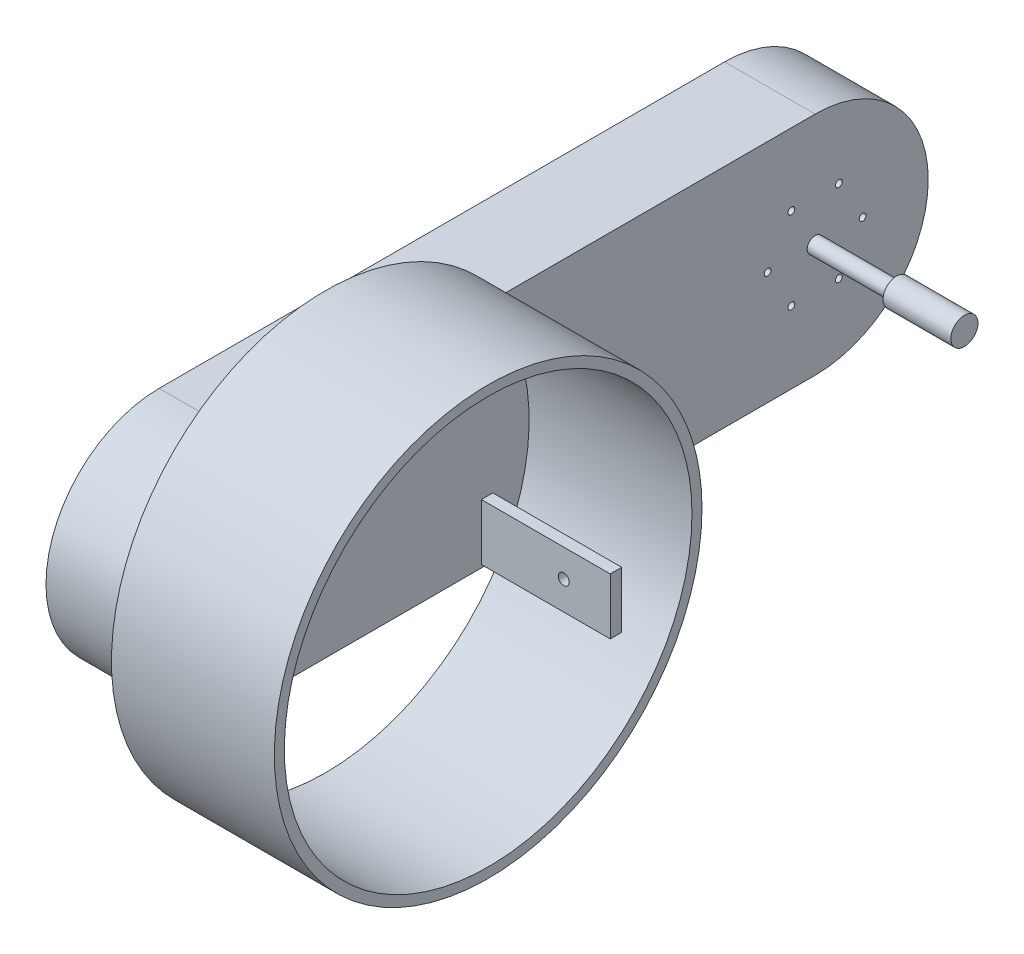
ISO-10303-21;
HEADER;
FILE_DESCRIPTION(('STEP AP214'),'2;1');
FILE_NAME('part.step','',(''),(''),'','','');
FILE_SCHEMA(('AUTOMOTIVE_DESIGN { 1 0 10303 214 1 1 1 1 }'));
ENDSEC;
DATA;
#1=APPLICATION_CONTEXT('core data for automotive mechanical design processes');
#2=APPLICATION_PROTOCOL_DEFINITION('international standard','automotive_design',2000,#1);
#3=PRODUCT_CONTEXT('',#1,'mechanical');
#4=PRODUCT('Part','Part','',(#3));
#5=PRODUCT_RELATED_PRODUCT_CATEGORY('part','',(#4));
#6=PRODUCT_DEFINITION_FORMATION('','',#4);
#7=PRODUCT_DEFINITION_CONTEXT('part definition',#1,'design');
#8=PRODUCT_DEFINITION('design','',#6,#7);
#9=PRODUCT_DEFINITION_SHAPE('','',#8);
#10=(LENGTH_UNIT() NAMED_UNIT(*) SI_UNIT(.MILLI.,.METRE.));
#11=(NAMED_UNIT(*) PLANE_ANGLE_UNIT() SI_UNIT($,.RADIAN.));
#12=(NAMED_UNIT(*) SI_UNIT($,.STERADIAN.) SOLID_ANGLE_UNIT());
#13=UNCERTAINTY_MEASURE_WITH_UNIT(LENGTH_MEASURE(1.E-05),#10,'distance_accuracy_value','');
#14=(GEOMETRIC_REPRESENTATION_CONTEXT(3) GLOBAL_UNCERTAINTY_ASSIGNED_CONTEXT((#13)) GLOBAL_UNIT_ASSIGNED_CONTEXT((#10,
#11,#12)) REPRESENTATION_CONTEXT('',''));
#15=CARTESIAN_POINT('',(0.,0.,0.));
#16=DIRECTION('',(0.,0.,1.));
#17=DIRECTION('',(1.,0.,0.));
#18=AXIS2_PLACEMENT_3D('',#15,#16,#17);
#19=CARTESIAN_POINT('',(40.,0.,0.));
#20=DIRECTION('',(1.,0.,0.));
#21=DIRECTION('',(0.,0.,-1.));
#22=AXIS2_PLACEMENT_3D('',#19,#20,#21);
#23=PLANE('',#22);
#24=DIRECTION('',(0.,0.,-1.));
#25=VECTOR('',#24,1.);
#26=CARTESIAN_POINT('',(40.,-44.7998879399822,-94.7304857898006));
#27=LINE('',#26,#25);
#28=CARTESIAN_POINT('',(40.,-44.7998879399822,-94.7304857898006));
#29=VERTEX_POINT('',#28);
#30=CARTESIAN_POINT('',(40.,-44.7998879399822,-99.8044234524712));
#31=VERTEX_POINT('',#30);
#32=EDGE_CURVE('E198',#29,#31,#27,.T.);
#33=ORIENTED_EDGE('',*,*,#32,.F.);
#34=DIRECTION('',(0.,-1.,0.));
#35=VECTOR('',#34,1.);
#36=CARTESIAN_POINT('',(40.,-19.9063820917189,-94.7304857898006));
#37=LINE('',#36,#35);
#38=CARTESIAN_POINT('',(40.,-19.9063820917189,-94.7304857898006));
#39=VERTEX_POINT('',#38);
#40=EDGE_CURVE('E184',#39,#29,#37,.T.);
#41=ORIENTED_EDGE('',*,*,#40,.F.);
#42=DIRECTION('',(0.,0.,1.));
#43=VECTOR('',#42,1.);
#44=CARTESIAN_POINT('',(40.,-19.9063820917189,-94.7304857898006));
#45=LINE('',#44,#43);
#46=CARTESIAN_POINT('',(40.,-19.9063820917189,-99.8044234524712));
#47=VERTEX_POINT('',#46);
#48=EDGE_CURVE('E189',#47,#39,#45,.T.);
#49=ORIENTED_EDGE('',*,*,#48,.F.);
#50=DIRECTION('',(0.,1.,0.));
#51=VECTOR('',#50,1.);
#52=CARTESIAN_POINT('',(40.,-19.9063820917189,-99.8044234524712));
#53=LINE('',#52,#51);
#54=EDGE_CURVE('E200',#31,#47,#53,.T.);
#55=ORIENTED_EDGE('',*,*,#54,.F.);
#56=EDGE_LOOP('',(#33,#41,#49,#55));
#57=FACE_BOUND('',#56,.T.);
#58=CARTESIAN_POINT('',(40.,0.,0.));
#59=DIRECTION('',(1.,0.,0.));
#60=DIRECTION('',(0.,0.,-1.));
#61=AXIS2_PLACEMENT_3D('',#58,#59,#60);
#62=CIRCLE('',#61,7.62127311165986);
#63=CARTESIAN_POINT('',(40.,0.,-7.62127311165986));
#64=VERTEX_POINT('',#63);
#65=EDGE_CURVE('E213',#64,#64,#62,.T.);
#66=ORIENTED_EDGE('',*,*,#65,.F.);
#67=EDGE_LOOP('',(#66));
#68=FACE_BOUND('',#67,.T.);
#69=CARTESIAN_POINT('',(40.,-8.6577510137719E-12,-25.7499999999999));
#70=DIRECTION('',(1.,0.,0.));
#71=DIRECTION('',(0.,0.,-1.));
#72=AXIS2_PLACEMENT_3D('',#69,#70,#71);
#73=CIRCLE('',#72,90.1076127938101);
#74=CARTESIAN_POINT('',(40.,-46.1403508771913,-103.147996772072));
#75=VERTEX_POINT('',#74);
#76=CARTESIAN_POINT('',(40.,53.8596491228087,-97.9893250229139));
#77=VERTEX_POINT('',#76);
#78=EDGE_CURVE('E156',#75,#77,#73,.T.);
#79=ORIENTED_EDGE('',*,*,#78,.T.);
#80=DIRECTION('',(0.,0.,1.));
#81=VECTOR('',#80,1.);
#82=CARTESIAN_POINT('',(40.,53.8596491228087,0.));
#83=LINE('',#82,#81);
#84=CARTESIAN_POINT('',(40.,53.8596491228087,7.70897832817341));
#85=VERTEX_POINT('',#84);
#86=EDGE_CURVE('E142',#77,#85,#83,.T.);
#87=ORIENTED_EDGE('',*,*,#86,.T.);
#88=CARTESIAN_POINT('',(40.,3.85964912280871,7.70897832817341));
#89=DIRECTION('',(1.,0.,0.));
#90=DIRECTION('',(0.,0.,-1.));
#91=AXIS2_PLACEMENT_3D('',#88,#89,#90);
#92=CIRCLE('',#91,50.);
#93=CARTESIAN_POINT('',(40.,-46.1403508771913,7.70897832817338));
#94=VERTEX_POINT('',#93);
#95=EDGE_CURVE('E296',#85,#94,#92,.T.);
#96=ORIENTED_EDGE('',*,*,#95,.T.);
#97=DIRECTION('',(0.,0.,-1.));
#98=VECTOR('',#97,1.);
#99=CARTESIAN_POINT('',(40.,-46.1403508771913,0.));
#100=LINE('',#99,#98);
#101=EDGE_CURVE('E157',#94,#75,#100,.T.);
#102=ORIENTED_EDGE('',*,*,#101,.T.);
#103=EDGE_LOOP('',(#79,#87,#96,#102));
#104=FACE_BOUND('',#103,.T.);
#105=ADVANCED_FACE('F38',(#57,#68,#104),#23,.T.);
#106=CARTESIAN_POINT('',(40.,3.85964912280871,-242.291021671827));
#107=DIRECTION('',(1.,0.,0.));
#108=DIRECTION('',(0.,0.,-1.));
#109=AXIS2_PLACEMENT_3D('',#106,#107,#108);
#110=CIRCLE('',#109,3.49999999999999);
#111=CARTESIAN_POINT('',(40.,3.85964912280871,-245.791021671827));
#112=VERTEX_POINT('',#111);
#113=EDGE_CURVE('E11',#112,#112,#110,.T.);
#114=ORIENTED_EDGE('',*,*,#113,.F.);
#115=EDGE_LOOP('',(#114));
#116=FACE_BOUND('',#115,.T.);
#117=CARTESIAN_POINT('',(40.,22.0461826022819,-252.791021671827));
#118=DIRECTION('',(1.,0.,0.));
#119=DIRECTION('',(0.,0.,-1.));
#120=AXIS2_PLACEMENT_3D('',#117,#118,#119);
#121=CIRCLE('',#120,1.50000000000002);
#122=CARTESIAN_POINT('',(40.,22.0461826022819,-254.291021671827));
#123=VERTEX_POINT('',#122);
#124=EDGE_CURVE('E258',#123,#123,#121,.T.);
#125=ORIENTED_EDGE('',*,*,#124,.F.);
#126=EDGE_LOOP('',(#125));
#127=FACE_BOUND('',#126,.T.);
#128=CARTESIAN_POINT('',(40.,3.85964912280871,-263.291021671827));
#129=DIRECTION('',(1.,0.,0.));
#130=DIRECTION('',(0.,0.,-1.));
#131=AXIS2_PLACEMENT_3D('',#128,#129,#130);
#132=CIRCLE('',#131,1.50000000000002);
#133=CARTESIAN_POINT('',(40.,3.85964912280871,-264.791021671827));
#134=VERTEX_POINT('',#133);
#135=EDGE_CURVE('E255',#134,#134,#132,.T.);
#136=ORIENTED_EDGE('',*,*,#135,.F.);
#137=EDGE_LOOP('',(#136));
#138=FACE_BOUND('',#137,.T.);
#139=CARTESIAN_POINT('',(40.,-14.3268843566645,-252.791021671827));
#140=DIRECTION('',(1.,0.,0.));
#141=DIRECTION('',(0.,0.,-1.));
#142=AXIS2_PLACEMENT_3D('',#139,#140,#141);
#143=CIRCLE('',#142,1.50000000000002);
#144=CARTESIAN_POINT('',(40.,-14.3268843566645,-254.291021671827));
#145=VERTEX_POINT('',#144);
#146=EDGE_CURVE('E252',#145,#145,#143,.T.);
#147=ORIENTED_EDGE('',*,*,#146,.F.);
#148=EDGE_LOOP('',(#147));
#149=FACE_BOUND('',#148,.T.);
#150=CARTESIAN_POINT('',(40.,-14.3268843566645,-231.791021671827));
#151=DIRECTION('',(1.,0.,0.));
#152=DIRECTION('',(0.,0.,-1.));
#153=AXIS2_PLACEMENT_3D('',#150,#151,#152);
#154=CIRCLE('',#153,1.5);
#155=CARTESIAN_POINT('',(40.,-14.3268843566645,-233.291021671827));
#156=VERTEX_POINT('',#155);
#157=EDGE_CURVE('E249',#156,#156,#154,.T.);
#158=ORIENTED_EDGE('',*,*,#157,.F.);
#159=EDGE_LOOP('',(#158));
#160=FACE_BOUND('',#159,.T.);
#161=CARTESIAN_POINT('',(40.,3.85964912280871,-221.291021671827));
#162=DIRECTION('',(1.,0.,0.));
#163=DIRECTION('',(0.,0.,-1.));
#164=AXIS2_PLACEMENT_3D('',#161,#162,#163);
#165=CIRCLE('',#164,1.5);
#166=CARTESIAN_POINT('',(40.,3.85964912280871,-222.791021671827));
#167=VERTEX_POINT('',#166);
#168=EDGE_CURVE('E246',#167,#167,#165,.T.);
#169=ORIENTED_EDGE('',*,*,#168,.F.);
#170=EDGE_LOOP('',(#169));
#171=FACE_BOUND('',#170,.T.);
#172=CARTESIAN_POINT('',(40.,22.0461826022819,-231.791021671827));
#173=DIRECTION('',(1.,0.,0.));
#174=DIRECTION('',(0.,0.,-1.));
#175=AXIS2_PLACEMENT_3D('',#172,#173,#174);
#176=CIRCLE('',#175,1.49999999999995);
#177=CARTESIAN_POINT('',(40.,22.0461826022819,-233.291021671827));
#178=VERTEX_POINT('',#177);
#179=EDGE_CURVE('E243',#178,#178,#176,.T.);
#180=ORIENTED_EDGE('',*,*,#179,.F.);
#181=EDGE_LOOP('',(#180));
#182=FACE_BOUND('',#181,.T.);
#183=CARTESIAN_POINT('',(40.,53.8596491228087,-242.291021671827));
#184=VERTEX_POINT('',#183);
#185=CARTESIAN_POINT('',(40.,53.8596491228087,-103.429153906576));
#186=VERTEX_POINT('',#185);
#187=EDGE_CURVE('E154',#184,#186,#83,.T.);
#188=ORIENTED_EDGE('',*,*,#187,.T.);
#189=CARTESIAN_POINT('',(40.,-8.6577510137719E-12,-25.7499999999999));
#190=DIRECTION('',(1.,0.,0.));
#191=DIRECTION('',(0.,0.,-1.));
#192=AXIS2_PLACEMENT_3D('',#189,#190,#191);
#193=CIRCLE('',#192,94.5246674433425);
#194=CARTESIAN_POINT('',(40.,-46.1403508771913,-108.248368324501));
#195=VERTEX_POINT('',#194);
#196=EDGE_CURVE('E55',#195,#186,#193,.T.);
#197=ORIENTED_EDGE('',*,*,#196,.F.);
#198=CARTESIAN_POINT('',(40.,-46.1403508771913,-242.291021671827));
#199=VERTEX_POINT('',#198);
#200=EDGE_CURVE('E294',#195,#199,#100,.T.);
#201=ORIENTED_EDGE('',*,*,#200,.T.);
#202=CARTESIAN_POINT('',(40.,3.85964912280871,-242.291021671827));
#203=DIRECTION('',(1.,0.,0.));
#204=DIRECTION('',(0.,0.,-1.));
#205=AXIS2_PLACEMENT_3D('',#202,#203,#204);
#206=CIRCLE('',#205,50.);
#207=EDGE_CURVE('E152',#199,#184,#206,.T.);
#208=ORIENTED_EDGE('',*,*,#207,.T.);
#209=EDGE_LOOP('',(#188,#197,#201,#208));
#210=FACE_BOUND('',#209,.T.);
#211=ADVANCED_FACE('F338',(#116,#127,#138,#149,#160,#171,#182,#210),#23,.T.);
#212=CARTESIAN_POINT('',(40.,-46.1403508771913,0.));
#213=DIRECTION('',(0.,1.,0.));
#214=DIRECTION('',(0.,0.,1.));
#215=AXIS2_PLACEMENT_3D('',#212,#213,#214);
#216=PLANE('',#215);
#217=DIRECTION('',(0.,0.,-1.));
#218=VECTOR('',#217,1.);
#219=CARTESIAN_POINT('',(0.,-46.1403508771913,0.));
#220=LINE('',#219,#218);
#221=CARTESIAN_POINT('',(0.,-46.1403508771913,7.70897832817338));
#222=VERTEX_POINT('',#221);
#223=CARTESIAN_POINT('',(0.,-46.1403508771913,-242.291021671827));
#224=VERTEX_POINT('',#223);
#225=EDGE_CURVE('E265',#222,#224,#220,.T.);
#226=ORIENTED_EDGE('',*,*,#225,.T.);
#227=DIRECTION('',(-1.,0.,0.));
#228=VECTOR('',#227,1.);
#229=CARTESIAN_POINT('',(40.,-46.1403508771913,-242.291021671827));
#230=LINE('',#229,#228);
#231=EDGE_CURVE('E47',#199,#224,#230,.T.);
#232=ORIENTED_EDGE('',*,*,#231,.F.);
#233=ORIENTED_EDGE('',*,*,#200,.F.);
#234=DIRECTION('',(0.,0.,-1.));
#235=VECTOR('',#234,1.);
#236=CARTESIAN_POINT('',(40.,-46.1403508771913,0.));
#237=LINE('',#236,#235);
#238=EDGE_CURVE('E62',#75,#195,#237,.T.);
#239=ORIENTED_EDGE('',*,*,#238,.F.);
#240=ORIENTED_EDGE('',*,*,#101,.F.);
#241=DIRECTION('',(-1.,0.,0.));
#242=VECTOR('',#241,1.);
#243=CARTESIAN_POINT('',(40.,-46.1403508771913,7.70897832817338));
#244=LINE('',#243,#242);
#245=EDGE_CURVE('E298',#94,#222,#244,.T.);
#246=ORIENTED_EDGE('',*,*,#245,.T.);
#247=EDGE_LOOP('',(#226,#232,#233,#239,#240,#246));
#248=FACE_BOUND('',#247,.T.);
#249=ADVANCED_FACE('F40',(#248),#216,.F.);
#250=CARTESIAN_POINT('',(40.,3.85964912280871,-242.291021671827));
#251=DIRECTION('',(-1.,0.,0.));
#252=DIRECTION('',(0.,0.,1.));
#253=AXIS2_PLACEMENT_3D('',#250,#251,#252);
#254=CYLINDRICAL_SURFACE('',#253,50.);
#255=CARTESIAN_POINT('',(0.,3.85964912280871,-242.291021671827));
#256=DIRECTION('',(1.,0.,0.));
#257=DIRECTION('',(0.,0.,-1.));
#258=AXIS2_PLACEMENT_3D('',#255,#256,#257);
#259=CIRCLE('',#258,50.);
#260=CARTESIAN_POINT('',(0.,53.8596491228087,-242.291021671827));
#261=VERTEX_POINT('',#260);
#262=EDGE_CURVE('E301',#224,#261,#259,.T.);
#263=ORIENTED_EDGE('',*,*,#262,.T.);
#264=DIRECTION('',(-1.,0.,0.));
#265=VECTOR('',#264,1.);
#266=CARTESIAN_POINT('',(40.,53.8596491228087,-242.291021671827));
#267=LINE('',#266,#265);
#268=EDGE_CURVE('E310',#184,#261,#267,.T.);
#269=ORIENTED_EDGE('',*,*,#268,.F.);
#270=ORIENTED_EDGE('',*,*,#207,.F.);
#271=ORIENTED_EDGE('',*,*,#231,.T.);
#272=EDGE_LOOP('',(#263,#269,#270,#271));
#273=FACE_BOUND('',#272,.T.);
#274=ADVANCED_FACE('F316',(#273),#254,.T.);
#275=CARTESIAN_POINT('',(40.,53.8596491228087,0.));
#276=DIRECTION('',(0.,-1.,0.));
#277=DIRECTION('',(0.,0.,-1.));
#278=AXIS2_PLACEMENT_3D('',#275,#276,#277);
#279=PLANE('',#278);
#280=DIRECTION('',(0.,0.,1.));
#281=VECTOR('',#280,1.);
#282=CARTESIAN_POINT('',(0.,53.8596491228087,0.));
#283=LINE('',#282,#281);
#284=CARTESIAN_POINT('',(0.,53.8596491228087,7.70897832817341));
#285=VERTEX_POINT('',#284);
#286=EDGE_CURVE('E303',#261,#285,#283,.T.);
#287=ORIENTED_EDGE('',*,*,#286,.T.);
#288=DIRECTION('',(-1.,0.,0.));
#289=VECTOR('',#288,1.);
#290=CARTESIAN_POINT('',(40.,53.8596491228087,7.70897832817341));
#291=LINE('',#290,#289);
#292=EDGE_CURVE('E149',#85,#285,#291,.T.);
#293=ORIENTED_EDGE('',*,*,#292,.F.);
#294=ORIENTED_EDGE('',*,*,#86,.F.);
#295=EDGE_CURVE('E147',#186,#77,#83,.T.);
#296=ORIENTED_EDGE('',*,*,#295,.F.);
#297=ORIENTED_EDGE('',*,*,#187,.F.);
#298=ORIENTED_EDGE('',*,*,#268,.T.);
#299=EDGE_LOOP('',(#287,#293,#294,#296,#297,#298));
#300=FACE_BOUND('',#299,.T.);
#301=ADVANCED_FACE('F144',(#300),#279,.F.);
#302=CARTESIAN_POINT('',(40.,3.85964912280871,7.70897832817341));
#303=DIRECTION('',(-1.,0.,0.));
#304=DIRECTION('',(0.,0.,1.));
#305=AXIS2_PLACEMENT_3D('',#302,#303,#304);
#306=CYLINDRICAL_SURFACE('',#305,50.);
#307=CARTESIAN_POINT('',(0.,3.85964912280871,7.70897832817341));
#308=DIRECTION('',(1.,0.,0.));
#309=DIRECTION('',(0.,0.,-1.));
#310=AXIS2_PLACEMENT_3D('',#307,#308,#309);
#311=CIRCLE('',#310,50.);
#312=EDGE_CURVE('E305',#285,#222,#311,.T.);
#313=ORIENTED_EDGE('',*,*,#312,.T.);
#314=ORIENTED_EDGE('',*,*,#245,.F.);
#315=ORIENTED_EDGE('',*,*,#95,.F.);
#316=ORIENTED_EDGE('',*,*,#292,.T.);
#317=EDGE_LOOP('',(#313,#314,#315,#316));
#318=FACE_BOUND('',#317,.T.);
#319=ADVANCED_FACE('F325',(#318),#306,.T.);
#320=CARTESIAN_POINT('',(0.,0.,0.));
#321=DIRECTION('',(1.,0.,0.));
#322=DIRECTION('',(0.,0.,-1.));
#323=AXIS2_PLACEMENT_3D('',#320,#321,#322);
#324=PLANE('',#323);
#325=CARTESIAN_POINT('',(0.,3.85964912280871,7.70897832817341));
#326=DIRECTION('',(1.,0.,0.));
#327=DIRECTION('',(0.,0.,-1.));
#328=AXIS2_PLACEMENT_3D('',#325,#326,#327);
#329=CIRCLE('',#328,46.);
#330=CARTESIAN_POINT('',(0.,49.8596491228087,7.70897832817341));
#331=VERTEX_POINT('',#330);
#332=CARTESIAN_POINT('',(0.,-42.1403508771913,7.70897832817336));
#333=VERTEX_POINT('',#332);
#334=EDGE_CURVE('E271',#331,#333,#329,.T.);
#335=ORIENTED_EDGE('',*,*,#334,.T.);
#336=DIRECTION('',(0.,0.,-1.));
#337=VECTOR('',#336,1.);
#338=CARTESIAN_POINT('',(0.,-42.1403508771913,0.));
#339=LINE('',#338,#337);
#340=CARTESIAN_POINT('',(0.,-42.1403508771913,-242.291021671827));
#341=VERTEX_POINT('',#340);
#342=EDGE_CURVE('E261',#333,#341,#339,.T.);
#343=ORIENTED_EDGE('',*,*,#342,.T.);
#344=CARTESIAN_POINT('',(0.,3.85964912280871,-242.291021671827));
#345=DIRECTION('',(1.,0.,0.));
#346=DIRECTION('',(0.,0.,-1.));
#347=AXIS2_PLACEMENT_3D('',#344,#345,#346);
#348=CIRCLE('',#347,46.);
#349=CARTESIAN_POINT('',(0.,49.8596491228087,-242.291021671827));
#350=VERTEX_POINT('',#349);
#351=EDGE_CURVE('E285',#341,#350,#348,.T.);
#352=ORIENTED_EDGE('',*,*,#351,.T.);
#353=DIRECTION('',(0.,0.,1.));
#354=VECTOR('',#353,1.);
#355=CARTESIAN_POINT('',(0.,49.8596491228087,0.));
#356=LINE('',#355,#354);
#357=EDGE_CURVE('E288',#350,#331,#356,.T.);
#358=ORIENTED_EDGE('',*,*,#357,.T.);
#359=EDGE_LOOP('',(#335,#343,#352,#358));
#360=FACE_BOUND('',#359,.T.);
#361=ORIENTED_EDGE('',*,*,#225,.F.);
#362=ORIENTED_EDGE('',*,*,#312,.F.);
#363=ORIENTED_EDGE('',*,*,#286,.F.);
#364=ORIENTED_EDGE('',*,*,#262,.F.);
#365=EDGE_LOOP('',(#361,#362,#363,#364));
#366=FACE_BOUND('',#365,.T.);
#367=ADVANCED_FACE('F322',(#360,#366),#324,.F.);
#368=CARTESIAN_POINT('',(40.,-42.1403508771913,0.));
#369=DIRECTION('',(0.,1.,0.));
#370=DIRECTION('',(0.,0.,1.));
#371=AXIS2_PLACEMENT_3D('',#368,#369,#370);
#372=PLANE('',#371);
#373=ORIENTED_EDGE('',*,*,#342,.F.);
#374=DIRECTION('',(1.,0.,0.));
#375=VECTOR('',#374,1.);
#376=CARTESIAN_POINT('',(40.,-42.1403508771913,7.70897832817338));
#377=LINE('',#376,#375);
#378=CARTESIAN_POINT('',(36.,-42.1403508771913,7.70897832817338));
#379=VERTEX_POINT('',#378);
#380=EDGE_CURVE('E272',#379,#333,#377,.F.);
#381=ORIENTED_EDGE('',*,*,#380,.F.);
#382=DIRECTION('',(0.,0.,-1.));
#383=VECTOR('',#382,1.);
#384=CARTESIAN_POINT('',(36.,-42.1403508771913,0.));
#385=LINE('',#384,#383);
#386=CARTESIAN_POINT('',(36.,-42.1403508771913,-242.291021671827));
#387=VERTEX_POINT('',#386);
#388=EDGE_CURVE('E267',#379,#387,#385,.T.);
#389=ORIENTED_EDGE('',*,*,#388,.T.);
#390=DIRECTION('',(-1.,0.,0.));
#391=VECTOR('',#390,1.);
#392=CARTESIAN_POINT('',(40.,-42.1403508771913,-242.291021671827));
#393=LINE('',#392,#391);
#394=EDGE_CURVE('E262',#387,#341,#393,.T.);
#395=ORIENTED_EDGE('',*,*,#394,.T.);
#396=EDGE_LOOP('',(#373,#381,#389,#395));
#397=FACE_BOUND('',#396,.T.);
#398=ADVANCED_FACE('F332',(#397),#372,.T.);
#399=CARTESIAN_POINT('',(40.,3.85964912280871,-242.291021671827));
#400=DIRECTION('',(-1.,0.,0.));
#401=DIRECTION('',(0.,0.,1.));
#402=AXIS2_PLACEMENT_3D('',#399,#400,#401);
#403=CYLINDRICAL_SURFACE('',#402,46.);
#404=ORIENTED_EDGE('',*,*,#351,.F.);
#405=ORIENTED_EDGE('',*,*,#394,.F.);
#406=CARTESIAN_POINT('',(36.,3.85964912280871,-242.291021671827));
#407=DIRECTION('',(1.,0.,0.));
#408=DIRECTION('',(0.,0.,-1.));
#409=AXIS2_PLACEMENT_3D('',#406,#407,#408);
#410=CIRCLE('',#409,46.);
#411=CARTESIAN_POINT('',(36.,49.8596491228087,-242.291021671827));
#412=VERTEX_POINT('',#411);
#413=EDGE_CURVE('E270',#387,#412,#410,.T.);
#414=ORIENTED_EDGE('',*,*,#413,.T.);
#415=DIRECTION('',(1.,0.,0.));
#416=VECTOR('',#415,1.);
#417=CARTESIAN_POINT('',(40.,49.8596491228087,-242.291021671827));
#418=LINE('',#417,#416);
#419=EDGE_CURVE('E266',#412,#350,#418,.F.);
#420=ORIENTED_EDGE('',*,*,#419,.T.);
#421=EDGE_LOOP('',(#404,#405,#414,#420));
#422=FACE_BOUND('',#421,.T.);
#423=ADVANCED_FACE('F361',(#422),#403,.F.);
#424=CARTESIAN_POINT('',(40.,49.8596491228087,0.));
#425=DIRECTION('',(0.,-1.,0.));
#426=DIRECTION('',(0.,0.,-1.));
#427=AXIS2_PLACEMENT_3D('',#424,#425,#426);
#428=PLANE('',#427);
#429=ORIENTED_EDGE('',*,*,#357,.F.);
#430=ORIENTED_EDGE('',*,*,#419,.F.);
#431=DIRECTION('',(0.,0.,1.));
#432=VECTOR('',#431,1.);
#433=CARTESIAN_POINT('',(36.,49.8596491228087,0.));
#434=LINE('',#433,#432);
#435=CARTESIAN_POINT('',(36.,49.8596491228087,7.70897832817341));
#436=VERTEX_POINT('',#435);
#437=EDGE_CURVE('E279',#412,#436,#434,.T.);
#438=ORIENTED_EDGE('',*,*,#437,.T.);
#439=DIRECTION('',(-1.,0.,0.));
#440=VECTOR('',#439,1.);
#441=CARTESIAN_POINT('',(40.,49.8596491228087,7.70897832817341));
#442=LINE('',#441,#440);
#443=EDGE_CURVE('E274',#436,#331,#442,.T.);
#444=ORIENTED_EDGE('',*,*,#443,.T.);
#445=EDGE_LOOP('',(#429,#430,#438,#444));
#446=FACE_BOUND('',#445,.T.);
#447=ADVANCED_FACE('F357',(#446),#428,.T.);
#448=CARTESIAN_POINT('',(40.,3.85964912280871,7.70897832817341));
#449=DIRECTION('',(-1.,0.,0.));
#450=DIRECTION('',(0.,0.,1.));
#451=AXIS2_PLACEMENT_3D('',#448,#449,#450);
#452=CYLINDRICAL_SURFACE('',#451,46.);
#453=ORIENTED_EDGE('',*,*,#334,.F.);
#454=ORIENTED_EDGE('',*,*,#443,.F.);
#455=CARTESIAN_POINT('',(36.,3.85964912280871,7.70897832817341));
#456=DIRECTION('',(1.,0.,0.));
#457=DIRECTION('',(0.,0.,-1.));
#458=AXIS2_PLACEMENT_3D('',#455,#456,#457);
#459=CIRCLE('',#458,46.);
#460=EDGE_CURVE('E275',#436,#379,#459,.T.);
#461=ORIENTED_EDGE('',*,*,#460,.T.);
#462=ORIENTED_EDGE('',*,*,#380,.T.);
#463=EDGE_LOOP('',(#453,#454,#461,#462));
#464=FACE_BOUND('',#463,.T.);
#465=ADVANCED_FACE('F353',(#464),#452,.F.);
#466=CARTESIAN_POINT('',(36.,0.,0.));
#467=DIRECTION('',(1.,0.,0.));
#468=DIRECTION('',(0.,0.,-1.));
#469=AXIS2_PLACEMENT_3D('',#466,#467,#468);
#470=PLANE('',#469);
#471=CARTESIAN_POINT('',(36.,0.,0.));
#472=DIRECTION('',(1.,0.,0.));
#473=DIRECTION('',(0.,0.,-1.));
#474=AXIS2_PLACEMENT_3D('',#471,#472,#473);
#475=CIRCLE('',#474,7.62127311165986);
#476=CARTESIAN_POINT('',(36.,0.,-7.62127311165986));
#477=VERTEX_POINT('',#476);
#478=EDGE_CURVE('E42',#477,#477,#475,.T.);
#479=ORIENTED_EDGE('',*,*,#478,.T.);
#480=EDGE_LOOP('',(#479));
#481=FACE_BOUND('',#480,.T.);
#482=CARTESIAN_POINT('',(36.,22.0461826022819,-252.791021671827));
#483=DIRECTION('',(-1.,0.,0.));
#484=DIRECTION('',(0.,0.,1.));
#485=AXIS2_PLACEMENT_3D('',#482,#483,#484);
#486=CIRCLE('',#485,1.50000000000002);
#487=CARTESIAN_POINT('',(36.,22.0461826022819,-251.291021671827));
#488=VERTEX_POINT('',#487);
#489=EDGE_CURVE('E224',#488,#488,#486,.T.);
#490=ORIENTED_EDGE('',*,*,#489,.F.);
#491=EDGE_LOOP('',(#490));
#492=FACE_BOUND('',#491,.T.);
#493=CARTESIAN_POINT('',(36.,3.85964912280871,-263.291021671827));
#494=DIRECTION('',(-1.,0.,0.));
#495=DIRECTION('',(0.,0.,1.));
#496=AXIS2_PLACEMENT_3D('',#493,#494,#495);
#497=CIRCLE('',#496,1.50000000000002);
#498=CARTESIAN_POINT('',(36.,3.85964912280871,-261.791021671827));
#499=VERTEX_POINT('',#498);
#500=EDGE_CURVE('E236',#499,#499,#497,.T.);
#501=ORIENTED_EDGE('',*,*,#500,.F.);
#502=EDGE_LOOP('',(#501));
#503=FACE_BOUND('',#502,.T.);
#504=CARTESIAN_POINT('',(36.,-14.3268843566645,-252.791021671827));
#505=DIRECTION('',(-1.,0.,0.));
#506=DIRECTION('',(0.,0.,1.));
#507=AXIS2_PLACEMENT_3D('',#504,#505,#506);
#508=CIRCLE('',#507,1.50000000000002);
#509=CARTESIAN_POINT('',(36.,-14.3268843566645,-251.291021671827));
#510=VERTEX_POINT('',#509);
#511=EDGE_CURVE('E233',#510,#510,#508,.T.);
#512=ORIENTED_EDGE('',*,*,#511,.F.);
#513=EDGE_LOOP('',(#512));
#514=FACE_BOUND('',#513,.T.);
#515=CARTESIAN_POINT('',(36.,-14.3268843566645,-231.791021671827));
#516=DIRECTION('',(-1.,0.,0.));
#517=DIRECTION('',(0.,0.,1.));
#518=AXIS2_PLACEMENT_3D('',#515,#516,#517);
#519=CIRCLE('',#518,1.5);
#520=CARTESIAN_POINT('',(36.,-14.3268843566645,-230.291021671827));
#521=VERTEX_POINT('',#520);
#522=EDGE_CURVE('E230',#521,#521,#519,.T.);
#523=ORIENTED_EDGE('',*,*,#522,.F.);
#524=EDGE_LOOP('',(#523));
#525=FACE_BOUND('',#524,.T.);
#526=CARTESIAN_POINT('',(36.,3.85964912280871,-221.291021671827));
#527=DIRECTION('',(-1.,0.,0.));
#528=DIRECTION('',(0.,0.,1.));
#529=AXIS2_PLACEMENT_3D('',#526,#527,#528);
#530=CIRCLE('',#529,1.5);
#531=CARTESIAN_POINT('',(36.,3.85964912280871,-219.791021671827));
#532=VERTEX_POINT('',#531);
#533=EDGE_CURVE('E226',#532,#532,#530,.T.);
#534=ORIENTED_EDGE('',*,*,#533,.F.);
#535=EDGE_LOOP('',(#534));
#536=FACE_BOUND('',#535,.T.);
#537=CARTESIAN_POINT('',(36.,22.0461826022819,-231.791021671827));
#538=DIRECTION('',(-1.,0.,0.));
#539=DIRECTION('',(0.,0.,1.));
#540=AXIS2_PLACEMENT_3D('',#537,#538,#539);
#541=CIRCLE('',#540,1.49999999999995);
#542=CARTESIAN_POINT('',(36.,22.0461826022819,-230.291021671827));
#543=VERTEX_POINT('',#542);
#544=EDGE_CURVE('E229',#543,#543,#541,.T.);
#545=ORIENTED_EDGE('',*,*,#544,.F.);
#546=EDGE_LOOP('',(#545));
#547=FACE_BOUND('',#546,.T.);
#548=ORIENTED_EDGE('',*,*,#388,.F.);
#549=ORIENTED_EDGE('',*,*,#460,.F.);
#550=ORIENTED_EDGE('',*,*,#437,.F.);
#551=ORIENTED_EDGE('',*,*,#413,.F.);
#552=EDGE_LOOP('',(#548,#549,#550,#551));
#553=FACE_BOUND('',#552,.T.);
#554=ADVANCED_FACE('F349',(#481,#492,#503,#514,#525,#536,#547,#553),#470,.F.);
#555=CARTESIAN_POINT('',(76.,22.0461826022819,-231.791021671827));
#556=DIRECTION('',(-1.,0.,0.));
#557=DIRECTION('',(0.,0.,1.));
#558=AXIS2_PLACEMENT_3D('',#555,#556,#557);
#559=CYLINDRICAL_SURFACE('',#558,1.49999999999995);
#560=ORIENTED_EDGE('',*,*,#179,.T.);
#561=EDGE_LOOP('',(#560));
#562=FACE_BOUND('',#561,.T.);
#563=ORIENTED_EDGE('',*,*,#544,.T.);
#564=EDGE_LOOP('',(#563));
#565=FACE_BOUND('',#564,.T.);
#566=ADVANCED_FACE('F352',(#562,#565),#559,.F.);
#567=CARTESIAN_POINT('',(76.,3.85964912280871,-221.291021671827));
#568=DIRECTION('',(-1.,0.,0.));
#569=DIRECTION('',(0.,0.,1.));
#570=AXIS2_PLACEMENT_3D('',#567,#568,#569);
#571=CYLINDRICAL_SURFACE('',#570,1.5);
#572=ORIENTED_EDGE('',*,*,#168,.T.);
#573=EDGE_LOOP('',(#572));
#574=FACE_BOUND('',#573,.T.);
#575=ORIENTED_EDGE('',*,*,#533,.T.);
#576=EDGE_LOOP('',(#575));
#577=FACE_BOUND('',#576,.T.);
#578=ADVANCED_FACE('F371',(#574,#577),#571,.F.);
#579=CARTESIAN_POINT('',(76.,-14.3268843566645,-231.791021671827));
#580=DIRECTION('',(-1.,0.,0.));
#581=DIRECTION('',(0.,0.,1.));
#582=AXIS2_PLACEMENT_3D('',#579,#580,#581);
#583=CYLINDRICAL_SURFACE('',#582,1.5);
#584=ORIENTED_EDGE('',*,*,#157,.T.);
#585=EDGE_LOOP('',(#584));
#586=FACE_BOUND('',#585,.T.);
#587=ORIENTED_EDGE('',*,*,#522,.T.);
#588=EDGE_LOOP('',(#587));
#589=FACE_BOUND('',#588,.T.);
#590=ADVANCED_FACE('F385',(#586,#589),#583,.F.);
#591=CARTESIAN_POINT('',(76.,-14.3268843566645,-252.791021671827));
#592=DIRECTION('',(-1.,0.,0.));
#593=DIRECTION('',(0.,0.,1.));
#594=AXIS2_PLACEMENT_3D('',#591,#592,#593);
#595=CYLINDRICAL_SURFACE('',#594,1.50000000000002);
#596=ORIENTED_EDGE('',*,*,#146,.T.);
#597=EDGE_LOOP('',(#596));
#598=FACE_BOUND('',#597,.T.);
#599=ORIENTED_EDGE('',*,*,#511,.T.);
#600=EDGE_LOOP('',(#599));
#601=FACE_BOUND('',#600,.T.);
#602=ADVANCED_FACE('F381',(#598,#601),#595,.F.);
#603=CARTESIAN_POINT('',(76.,3.85964912280871,-263.291021671827));
#604=DIRECTION('',(-1.,0.,0.));
#605=DIRECTION('',(0.,0.,1.));
#606=AXIS2_PLACEMENT_3D('',#603,#604,#605);
#607=CYLINDRICAL_SURFACE('',#606,1.50000000000002);
#608=ORIENTED_EDGE('',*,*,#135,.T.);
#609=EDGE_LOOP('',(#608));
#610=FACE_BOUND('',#609,.T.);
#611=ORIENTED_EDGE('',*,*,#500,.T.);
#612=EDGE_LOOP('',(#611));
#613=FACE_BOUND('',#612,.T.);
#614=ADVANCED_FACE('F377',(#610,#613),#607,.F.);
#615=CARTESIAN_POINT('',(76.,22.0461826022819,-252.791021671827));
#616=DIRECTION('',(-1.,0.,0.));
#617=DIRECTION('',(0.,0.,1.));
#618=AXIS2_PLACEMENT_3D('',#615,#616,#617);
#619=CYLINDRICAL_SURFACE('',#618,1.50000000000002);
#620=ORIENTED_EDGE('',*,*,#124,.T.);
#621=EDGE_LOOP('',(#620));
#622=FACE_BOUND('',#621,.T.);
#623=ORIENTED_EDGE('',*,*,#489,.T.);
#624=EDGE_LOOP('',(#623));
#625=FACE_BOUND('',#624,.T.);
#626=ADVANCED_FACE('F373',(#622,#625),#619,.F.);
#627=CARTESIAN_POINT('',(76.,3.85964912280871,-242.291021671827));
#628=DIRECTION('',(-1.,0.,0.));
#629=DIRECTION('',(0.,0.,1.));
#630=AXIS2_PLACEMENT_3D('',#627,#628,#629);
#631=CYLINDRICAL_SURFACE('',#630,3.49999999999999);
#632=ORIENTED_EDGE('',*,*,#113,.T.);
#633=EDGE_LOOP('',(#632));
#634=FACE_BOUND('',#633,.T.);
#635=CARTESIAN_POINT('',(76.,3.85964912280871,-242.291021671827));
#636=DIRECTION('',(-1.,0.,0.));
#637=DIRECTION('',(0.,0.,1.));
#638=AXIS2_PLACEMENT_3D('',#635,#636,#637);
#639=CIRCLE('',#638,3.49999999999999);
#640=CARTESIAN_POINT('',(76.,3.85964912280871,-238.791021671827));
#641=VERTEX_POINT('',#640);
#642=EDGE_CURVE('E219',#641,#641,#639,.T.);
#643=ORIENTED_EDGE('',*,*,#642,.T.);
#644=EDGE_LOOP('',(#643));
#645=FACE_BOUND('',#644,.T.);
#646=ADVANCED_FACE('F376',(#634,#645),#631,.T.);
#647=CARTESIAN_POINT('',(106.,3.85964912285286,-242.291021671694));
#648=DIRECTION('',(-1.,0.,0.));
#649=DIRECTION('',(0.,0.,1.));
#650=AXIS2_PLACEMENT_3D('',#647,#648,#649);
#651=CYLINDRICAL_SURFACE('',#650,6.00000000000002);
#652=CARTESIAN_POINT('',(106.,3.85964912285286,-242.291021671694));
#653=DIRECTION('',(1.,0.,0.));
#654=DIRECTION('',(0.,0.,-1.));
#655=AXIS2_PLACEMENT_3D('',#652,#653,#654);
#656=CIRCLE('',#655,6.00000000000002);
#657=CARTESIAN_POINT('',(106.,3.85964912285286,-248.291021671694));
#658=VERTEX_POINT('',#657);
#659=EDGE_CURVE('E216',#658,#658,#656,.T.);
#660=ORIENTED_EDGE('',*,*,#659,.F.);
#661=EDGE_LOOP('',(#660));
#662=FACE_BOUND('',#661,.T.);
#663=CARTESIAN_POINT('',(76.,3.85964912285286,-242.291021671694));
#664=DIRECTION('',(1.,0.,0.));
#665=DIRECTION('',(0.,0.,-1.));
#666=AXIS2_PLACEMENT_3D('',#663,#664,#665);
#667=CIRCLE('',#666,6.00000000000002);
#668=CARTESIAN_POINT('',(76.,3.85964912285286,-248.291021671694));
#669=VERTEX_POINT('',#668);
#670=EDGE_CURVE('E220',#669,#669,#667,.T.);
#671=ORIENTED_EDGE('',*,*,#670,.T.);
#672=EDGE_LOOP('',(#671));
#673=FACE_BOUND('',#672,.T.);
#674=ADVANCED_FACE('F395',(#662,#673),#651,.T.);
#675=CARTESIAN_POINT('',(106.,3.85964912285286,-242.291021671694));
#676=DIRECTION('',(1.,0.,0.));
#677=DIRECTION('',(0.,0.,-1.));
#678=AXIS2_PLACEMENT_3D('',#675,#676,#677);
#679=PLANE('',#678);
#680=ORIENTED_EDGE('',*,*,#659,.T.);
#681=EDGE_LOOP('',(#680));
#682=FACE_BOUND('',#681,.T.);
#683=ADVANCED_FACE('F399',(#682),#679,.T.);
#684=CARTESIAN_POINT('',(76.,3.85964912285286,-242.291021671694));
#685=DIRECTION('',(1.,0.,0.));
#686=DIRECTION('',(0.,0.,-1.));
#687=AXIS2_PLACEMENT_3D('',#684,#685,#686);
#688=PLANE('',#687);
#689=ORIENTED_EDGE('',*,*,#642,.F.);
#690=EDGE_LOOP('',(#689));
#691=FACE_BOUND('',#690,.T.);
#692=ORIENTED_EDGE('',*,*,#670,.F.);
#693=EDGE_LOOP('',(#692));
#694=FACE_BOUND('',#693,.T.);
#695=ADVANCED_FACE('F401',(#691,#694),#688,.F.);
#696=CARTESIAN_POINT('',(30.,0.,0.));
#697=DIRECTION('',(1.,0.,0.));
#698=DIRECTION('',(0.,0.,-1.));
#699=AXIS2_PLACEMENT_3D('',#696,#697,#698);
#700=CYLINDRICAL_SURFACE('',#699,7.62127311165986);
#701=ORIENTED_EDGE('',*,*,#65,.T.);
#702=EDGE_LOOP('',(#701));
#703=FACE_BOUND('',#702,.T.);
#704=ORIENTED_EDGE('',*,*,#478,.F.);
#705=EDGE_LOOP('',(#704));
#706=FACE_BOUND('',#705,.T.);
#707=ADVANCED_FACE('F404',(#703,#706),#700,.F.);
#708=CARTESIAN_POINT('',(97.,-19.9063820917189,-94.7304857898006));
#709=DIRECTION('',(0.,0.,-1.));
#710=DIRECTION('',(-1.,0.,0.));
#711=AXIS2_PLACEMENT_3D('',#708,#709,#710);
#712=PLANE('',#711);
#713=CARTESIAN_POINT('',(76.4309329385962,-32.2049808578752,-94.7304857898006));
#714=DIRECTION('',(0.,0.,-1.));
#715=DIRECTION('',(-1.,0.,0.));
#716=AXIS2_PLACEMENT_3D('',#713,#714,#715);
#717=CIRCLE('',#716,2.42948243993926);
#718=CARTESIAN_POINT('',(74.001450498657,-32.2049808578752,-94.7304857898006));
#719=VERTEX_POINT('',#718);
#720=EDGE_CURVE('E181',#719,#719,#717,.T.);
#721=ORIENTED_EDGE('',*,*,#720,.T.);
#722=EDGE_LOOP('',(#721));
#723=FACE_BOUND('',#722,.T.);
#724=ORIENTED_EDGE('',*,*,#40,.T.);
#725=DIRECTION('',(-1.,0.,0.));
#726=VECTOR('',#725,1.);
#727=CARTESIAN_POINT('',(97.,-44.7998879399822,-94.7304857898006));
#728=LINE('',#727,#726);
#729=CARTESIAN_POINT('',(97.,-44.7998879399822,-94.7304857898006));
#730=VERTEX_POINT('',#729);
#731=EDGE_CURVE('E211',#730,#29,#728,.T.);
#732=ORIENTED_EDGE('',*,*,#731,.F.);
#733=DIRECTION('',(0.,-1.,0.));
#734=VECTOR('',#733,1.);
#735=CARTESIAN_POINT('',(97.,-19.9063820917189,-94.7304857898006));
#736=LINE('',#735,#734);
#737=CARTESIAN_POINT('',(97.,-19.9063820917189,-94.7304857898006));
#738=VERTEX_POINT('',#737);
#739=EDGE_CURVE('E185',#738,#730,#736,.T.);
#740=ORIENTED_EDGE('',*,*,#739,.F.);
#741=DIRECTION('',(-1.,0.,0.));
#742=VECTOR('',#741,1.);
#743=CARTESIAN_POINT('',(97.,-19.9063820917189,-94.7304857898006));
#744=LINE('',#743,#742);
#745=EDGE_CURVE('E195',#738,#39,#744,.T.);
#746=ORIENTED_EDGE('',*,*,#745,.T.);
#747=EDGE_LOOP('',(#724,#732,#740,#746));
#748=FACE_BOUND('',#747,.T.);
#749=ADVANCED_FACE('F411',(#723,#748),#712,.F.);
#750=CARTESIAN_POINT('',(97.,-44.7998879399822,-94.7304857898006));
#751=DIRECTION('',(0.,1.,0.));
#752=DIRECTION('',(0.,0.,1.));
#753=AXIS2_PLACEMENT_3D('',#750,#751,#752);
#754=PLANE('',#753);
#755=ORIENTED_EDGE('',*,*,#32,.T.);
#756=DIRECTION('',(-1.,0.,0.));
#757=VECTOR('',#756,1.);
#758=CARTESIAN_POINT('',(97.,-44.7998879399822,-99.8044234524712));
#759=LINE('',#758,#757);
#760=CARTESIAN_POINT('',(97.,-44.7998879399822,-99.8044234524712));
#761=VERTEX_POINT('',#760);
#762=EDGE_CURVE('E208',#761,#31,#759,.T.);
#763=ORIENTED_EDGE('',*,*,#762,.F.);
#764=DIRECTION('',(0.,0.,-1.));
#765=VECTOR('',#764,1.);
#766=CARTESIAN_POINT('',(97.,-44.7998879399822,-94.7304857898006));
#767=LINE('',#766,#765);
#768=EDGE_CURVE('E188',#730,#761,#767,.T.);
#769=ORIENTED_EDGE('',*,*,#768,.F.);
#770=ORIENTED_EDGE('',*,*,#731,.T.);
#771=EDGE_LOOP('',(#755,#763,#769,#770));
#772=FACE_BOUND('',#771,.T.);
#773=ADVANCED_FACE('F415',(#772),#754,.F.);
#774=CARTESIAN_POINT('',(97.,-19.9063820917189,-99.8044234524712));
#775=DIRECTION('',(0.,0.,1.));
#776=DIRECTION('',(1.,0.,0.));
#777=AXIS2_PLACEMENT_3D('',#774,#775,#776);
#778=PLANE('',#777);
#779=CARTESIAN_POINT('',(76.4309329385962,-32.2049808578752,-99.8044234524712));
#780=DIRECTION('',(0.,0.,-1.));
#781=DIRECTION('',(-1.,0.,0.));
#782=AXIS2_PLACEMENT_3D('',#779,#780,#781);
#783=CIRCLE('',#782,2.42948243993926);
#784=CARTESIAN_POINT('',(74.001450498657,-32.2049808578752,-99.8044234524712));
#785=VERTEX_POINT('',#784);
#786=EDGE_CURVE('E178',#785,#785,#783,.T.);
#787=ORIENTED_EDGE('',*,*,#786,.F.);
#788=EDGE_LOOP('',(#787));
#789=FACE_BOUND('',#788,.T.);
#790=ORIENTED_EDGE('',*,*,#54,.T.);
#791=DIRECTION('',(-1.,0.,0.));
#792=VECTOR('',#791,1.);
#793=CARTESIAN_POINT('',(97.,-19.9063820917189,-99.8044234524712));
#794=LINE('',#793,#792);
#795=CARTESIAN_POINT('',(97.,-19.9063820917189,-99.8044234524712));
#796=VERTEX_POINT('',#795);
#797=EDGE_CURVE('E206',#796,#47,#794,.T.);
#798=ORIENTED_EDGE('',*,*,#797,.F.);
#799=DIRECTION('',(0.,1.,0.));
#800=VECTOR('',#799,1.);
#801=CARTESIAN_POINT('',(97.,-19.9063820917189,-99.8044234524712));
#802=LINE('',#801,#800);
#803=EDGE_CURVE('E191',#761,#796,#802,.T.);
#804=ORIENTED_EDGE('',*,*,#803,.F.);
#805=ORIENTED_EDGE('',*,*,#762,.T.);
#806=EDGE_LOOP('',(#790,#798,#804,#805));
#807=FACE_BOUND('',#806,.T.);
#808=ADVANCED_FACE('F419',(#789,#807),#778,.F.);
#809=CARTESIAN_POINT('',(97.,-19.9063820917189,-94.7304857898006));
#810=DIRECTION('',(0.,-1.,0.));
#811=DIRECTION('',(0.,0.,-1.));
#812=AXIS2_PLACEMENT_3D('',#809,#810,#811);
#813=PLANE('',#812);
#814=ORIENTED_EDGE('',*,*,#48,.T.);
#815=ORIENTED_EDGE('',*,*,#745,.F.);
#816=DIRECTION('',(0.,0.,1.));
#817=VECTOR('',#816,1.);
#818=CARTESIAN_POINT('',(97.,-19.9063820917189,-94.7304857898006));
#819=LINE('',#818,#817);
#820=EDGE_CURVE('E193',#796,#738,#819,.T.);
#821=ORIENTED_EDGE('',*,*,#820,.F.);
#822=ORIENTED_EDGE('',*,*,#797,.T.);
#823=EDGE_LOOP('',(#814,#815,#821,#822));
#824=FACE_BOUND('',#823,.T.);
#825=ADVANCED_FACE('F423',(#824),#813,.F.);
#826=CARTESIAN_POINT('',(97.,0.,0.));
#827=DIRECTION('',(1.,0.,0.));
#828=DIRECTION('',(0.,0.,-1.));
#829=AXIS2_PLACEMENT_3D('',#826,#827,#828);
#830=PLANE('',#829);
#831=ORIENTED_EDGE('',*,*,#739,.T.);
#832=ORIENTED_EDGE('',*,*,#768,.T.);
#833=ORIENTED_EDGE('',*,*,#803,.T.);
#834=ORIENTED_EDGE('',*,*,#820,.T.);
#835=EDGE_LOOP('',(#831,#832,#833,#834));
#836=FACE_BOUND('',#835,.T.);
#837=ADVANCED_FACE('F427',(#836),#830,.T.);
#838=CARTESIAN_POINT('',(76.4309329385962,-32.2049808578752,-42.8044234524712));
#839=DIRECTION('',(0.,0.,-1.));
#840=DIRECTION('',(-1.,0.,0.));
#841=AXIS2_PLACEMENT_3D('',#838,#839,#840);
#842=CYLINDRICAL_SURFACE('',#841,2.42948243993926);
#843=CARTESIAN_POINT('',(74.001450498657,-32.2049808578752,-99.8044234524712));
#844=CARTESIAN_POINT('',(74.001450498657,-32.2049808578752,-99.7515699351517));
#845=CARTESIAN_POINT('',(74.001450498657,-32.2049808578752,-99.6987164178323));
#846=CARTESIAN_POINT('',(74.001450498657,-32.2049808578752,-99.5930093831933));
#847=CARTESIAN_POINT('',(74.001450498657,-32.2049808578752,-99.5401558658738));
#848=CARTESIAN_POINT('',(74.001450498657,-32.2049808578752,-99.4344488312348));
#849=CARTESIAN_POINT('',(74.001450498657,-32.2049808578752,-99.3815953139154));
#850=CARTESIAN_POINT('',(74.001450498657,-32.2049808578752,-99.2758882792764));
#851=CARTESIAN_POINT('',(74.001450498657,-32.2049808578752,-99.2230347619569));
#852=CARTESIAN_POINT('',(74.001450498657,-32.2049808578752,-99.1173277273179));
#853=CARTESIAN_POINT('',(74.001450498657,-32.2049808578752,-99.0644742099984));
#854=CARTESIAN_POINT('',(74.001450498657,-32.2049808578752,-98.9587671753595));
#855=CARTESIAN_POINT('',(74.001450498657,-32.2049808578752,-98.90591365804));
#856=CARTESIAN_POINT('',(74.001450498657,-32.2049808578752,-98.800206623401));
#857=CARTESIAN_POINT('',(74.001450498657,-32.2049808578752,-98.7473531060815));
#858=CARTESIAN_POINT('',(74.001450498657,-32.2049808578752,-98.6416460714426));
#859=CARTESIAN_POINT('',(74.001450498657,-32.2049808578752,-98.5887925541231));
#860=CARTESIAN_POINT('',(74.001450498657,-32.2049808578752,-98.4830855194841));
#861=CARTESIAN_POINT('',(74.001450498657,-32.2049808578752,-98.4302320021646));
#862=CARTESIAN_POINT('',(74.001450498657,-32.2049808578752,-98.3245249675256));
#863=CARTESIAN_POINT('',(74.001450498657,-32.2049808578752,-98.2716714502061));
#864=CARTESIAN_POINT('',(74.001450498657,-32.2049808578752,-98.1659644155672));
#865=CARTESIAN_POINT('',(74.001450498657,-32.2049808578752,-98.1131108982477));
#866=CARTESIAN_POINT('',(74.001450498657,-32.2049808578752,-98.0074038636087));
#867=CARTESIAN_POINT('',(74.001450498657,-32.2049808578752,-97.9545503462892));
#868=CARTESIAN_POINT('',(74.001450498657,-32.2049808578752,-97.8488433116503));
#869=CARTESIAN_POINT('',(74.001450498657,-32.2049808578752,-97.7959897943308));
#870=CARTESIAN_POINT('',(74.001450498657,-32.2049808578752,-97.6902827596918));
#871=CARTESIAN_POINT('',(74.001450498657,-32.2049808578752,-97.6374292423723));
#872=CARTESIAN_POINT('',(74.001450498657,-32.2049808578752,-97.5317222077334));
#873=CARTESIAN_POINT('',(74.001450498657,-32.2049808578752,-97.4788686904138));
#874=CARTESIAN_POINT('',(74.001450498657,-32.2049808578752,-97.3731616557749));
#875=CARTESIAN_POINT('',(74.001450498657,-32.2049808578752,-97.3203081384554));
#876=CARTESIAN_POINT('',(74.001450498657,-32.2049808578752,-97.2146011038164));
#877=CARTESIAN_POINT('',(74.001450498657,-32.2049808578752,-97.1617475864969));
#878=CARTESIAN_POINT('',(74.001450498657,-32.2049808578752,-97.056040551858));
#879=CARTESIAN_POINT('',(74.001450498657,-32.2049808578752,-97.0031870345385));
#880=CARTESIAN_POINT('',(74.001450498657,-32.2049808578752,-96.8974799998995));
#881=CARTESIAN_POINT('',(74.001450498657,-32.2049808578752,-96.84462648258));
#882=CARTESIAN_POINT('',(74.001450498657,-32.2049808578752,-96.7389194479411));
#883=CARTESIAN_POINT('',(74.001450498657,-32.2049808578752,-96.6860659306216));
#884=CARTESIAN_POINT('',(74.001450498657,-32.2049808578752,-96.5803588959826));
#885=CARTESIAN_POINT('',(74.001450498657,-32.2049808578752,-96.5275053786631));
#886=CARTESIAN_POINT('',(74.001450498657,-32.2049808578752,-96.4217983440241));
#887=CARTESIAN_POINT('',(74.001450498657,-32.2049808578752,-96.3689448267046));
#888=CARTESIAN_POINT('',(74.001450498657,-32.2049808578752,-96.2632377920657));
#889=CARTESIAN_POINT('',(74.001450498657,-32.2049808578752,-96.2103842747462));
#890=CARTESIAN_POINT('',(74.001450498657,-32.2049808578752,-96.1046772401072));
#891=CARTESIAN_POINT('',(74.001450498657,-32.2049808578752,-96.0518237227877));
#892=CARTESIAN_POINT('',(74.001450498657,-32.2049808578752,-95.9461166881488));
#893=CARTESIAN_POINT('',(74.001450498657,-32.2049808578752,-95.8932631708293));
#894=CARTESIAN_POINT('',(74.001450498657,-32.2049808578752,-95.7875561361903));
#895=CARTESIAN_POINT('',(74.001450498657,-32.2049808578752,-95.7347026188708));
#896=CARTESIAN_POINT('',(74.001450498657,-32.2049808578752,-95.6289955842318));
#897=CARTESIAN_POINT('',(74.001450498657,-32.2049808578752,-95.5761420669123));
#898=CARTESIAN_POINT('',(74.001450498657,-32.2049808578752,-95.4704350322734));
#899=CARTESIAN_POINT('',(74.001450498657,-32.2049808578752,-95.4175815149539));
#900=CARTESIAN_POINT('',(74.001450498657,-32.2049808578752,-95.3118744803149));
#901=CARTESIAN_POINT('',(74.001450498657,-32.2049808578752,-95.2590209629954));
#902=CARTESIAN_POINT('',(74.001450498657,-32.2049808578752,-95.1533139283565));
#903=CARTESIAN_POINT('',(74.001450498657,-32.2049808578752,-95.100460411037));
#904=CARTESIAN_POINT('',(74.001450498657,-32.2049808578752,-94.994753376398));
#905=CARTESIAN_POINT('',(74.001450498657,-32.2049808578752,-94.9418998590785));
#906=CARTESIAN_POINT('',(74.001450498657,-32.2049808578752,-94.8361928244396));
#907=CARTESIAN_POINT('',(74.001450498657,-32.2049808578752,-94.78333930712));
#908=CARTESIAN_POINT('',(74.001450498657,-32.2049808578752,-94.7304857898006));
#909=B_SPLINE_CURVE_WITH_KNOTS('',3,(#843,#844,#845,#846,#847,#848,#849,#850,#851,#852,#853,
#854,#855,#856,#857,#858,#859,#860,#861,#862,#863,#864,#865,#866,#867,#868,#869,#870,#871,#872,
#873,#874,#875,#876,#877,#878,#879,#880,#881,#882,#883,#884,#885,#886,#887,#888,#889,#890,#891,
#892,#893,#894,#895,#896,#897,#898,#899,#900,#901,#902,#903,#904,#905,#906,#907,#908),
.UNSPECIFIED.,.F.,.F.,(4,2,2,2,2,2,2,2,2,2,2,2,2,2,2,2,2,2,2,2,2,2,2,2,2,2,2,2,2,2,2,2,4),(0.,
0.158560551958453,0.317121103916906,0.47568165587536,0.634242207833827,0.792802759792294,
0.951363311750747,1.1099238637092,1.26848441566765,1.42704496762612,1.58560551958459,
1.74416607154304,1.90272662350149,2.06128717545995,2.2198477274184,2.37840827937687,
2.53696883133533,2.69552938329379,2.85408993525224,3.01265048721069,3.17121103916916,
3.32977159112763,3.48833214308608,3.64689269504453,3.80545324700299,3.96401379896145,
4.12257435091992,4.28113490287838,4.43969545483683,4.59825600679528,4.75681655875373,
4.9153771107122,5.07393766267067),.UNSPECIFIED.);
#910=EDGE_CURVE('BSEAM431',#785,#719,#909,.T.);
#911=ORIENTED_EDGE('',*,*,#786,.T.);
#912=ORIENTED_EDGE('',*,*,#720,.F.);
#913=ORIENTED_EDGE('',*,*,#910,.T.);
#914=ORIENTED_EDGE('',*,*,#910,.F.);
#915=EDGE_LOOP('',(#911,#913,#912,#914));
#916=FACE_BOUND('',#915,.T.);
#917=ADVANCED_FACE('F431',(#916),#842,.F.);
#918=CARTESIAN_POINT('',(40.,-8.6577510137719E-12,-25.7499999999999));
#919=DIRECTION('',(1.,0.,0.));
#920=DIRECTION('',(0.,0.,-1.));
#921=AXIS2_PLACEMENT_3D('',#918,#919,#920);
#922=PLANE('',#921);
#923=EDGE_CURVE('E161',#77,#75,#73,.T.);
#924=ORIENTED_EDGE('',*,*,#923,.T.);
#925=ORIENTED_EDGE('',*,*,#238,.T.);
#926=EDGE_CURVE('E167',#186,#195,#193,.T.);
#927=ORIENTED_EDGE('',*,*,#926,.F.);
#928=ORIENTED_EDGE('',*,*,#295,.T.);
#929=EDGE_LOOP('',(#924,#925,#927,#928));
#930=FACE_BOUND('',#929,.T.);
#931=ADVANCED_FACE('F165',(#930),#922,.F.);
#932=CARTESIAN_POINT('',(112.,-8.6577510137719E-12,-25.7499999999999));
#933=DIRECTION('',(1.,0.,0.));
#934=DIRECTION('',(0.,0.,-1.));
#935=AXIS2_PLACEMENT_3D('',#932,#933,#934);
#936=PLANE('',#935);
#937=CARTESIAN_POINT('',(112.,-8.6577510137719E-12,-25.7499999999999));
#938=DIRECTION('',(1.,0.,0.));
#939=DIRECTION('',(0.,0.,-1.));
#940=AXIS2_PLACEMENT_3D('',#937,#938,#939);
#941=CIRCLE('',#940,94.5246674433425);
#942=CARTESIAN_POINT('',(112.,-8.6577510137719E-12,-120.274667443342));
#943=VERTEX_POINT('',#942);
#944=EDGE_CURVE('E173',#943,#943,#941,.T.);
#945=ORIENTED_EDGE('',*,*,#944,.T.);
#946=EDGE_LOOP('',(#945));
#947=FACE_BOUND('',#946,.T.);
#948=CARTESIAN_POINT('',(112.,-8.6577510137719E-12,-25.7499999999999));
#949=DIRECTION('',(1.,0.,0.));
#950=DIRECTION('',(0.,0.,-1.));
#951=AXIS2_PLACEMENT_3D('',#948,#949,#950);
#952=CIRCLE('',#951,90.1076127938101);
#953=CARTESIAN_POINT('',(112.,-8.6577510137719E-12,-115.85761279381));
#954=VERTEX_POINT('',#953);
#955=EDGE_CURVE('E169',#954,#954,#952,.T.);
#956=ORIENTED_EDGE('',*,*,#955,.F.);
#957=EDGE_LOOP('',(#956));
#958=FACE_BOUND('',#957,.T.);
#959=ADVANCED_FACE('F439',(#947,#958),#936,.T.);
#960=CARTESIAN_POINT('',(112.,-8.6577510137719E-12,-25.7499999999999));
#961=DIRECTION('',(-1.,0.,0.));
#962=DIRECTION('',(0.,0.,1.));
#963=AXIS2_PLACEMENT_3D('',#960,#961,#962);
#964=CYLINDRICAL_SURFACE('',#963,94.5246674433425);
#965=ORIENTED_EDGE('',*,*,#944,.F.);
#966=EDGE_LOOP('',(#965));
#967=FACE_BOUND('',#966,.T.);
#968=ORIENTED_EDGE('',*,*,#926,.T.);
#969=ORIENTED_EDGE('',*,*,#196,.T.);
#970=EDGE_LOOP('',(#968,#969));
#971=FACE_BOUND('',#970,.T.);
#972=ADVANCED_FACE('F436',(#967,#971),#964,.T.);
#973=CARTESIAN_POINT('',(112.,-8.6577510137719E-12,-25.7499999999999));
#974=DIRECTION('',(-1.,0.,0.));
#975=DIRECTION('',(0.,0.,1.));
#976=AXIS2_PLACEMENT_3D('',#973,#974,#975);
#977=CYLINDRICAL_SURFACE('',#976,90.1076127938101);
#978=ORIENTED_EDGE('',*,*,#955,.T.);
#979=EDGE_LOOP('',(#978));
#980=FACE_BOUND('',#979,.T.);
#981=ORIENTED_EDGE('',*,*,#923,.F.);
#982=ORIENTED_EDGE('',*,*,#78,.F.);
#983=EDGE_LOOP('',(#981,#982));
#984=FACE_BOUND('',#983,.T.);
#985=ADVANCED_FACE('F168',(#980,#984),#977,.F.);
#986=CLOSED_SHELL('',(#105,#211,#249,#274,#301,#319,#367,#398,#423,#447,#465,#554,#566,#578,
#590,#602,#614,#626,#646,#674,#683,#695,#707,#749,#773,#808,#825,#837,#917,#931,#959,#972,#985));
#987=MANIFOLD_SOLID_BREP('B2',#986);
#988=ADVANCED_BREP_SHAPE_REPRESENTATION('',(#18,#987),#14);
#989=SHAPE_DEFINITION_REPRESENTATION(#9,#988);
ENDSEC;
END-ISO-10303-21;
